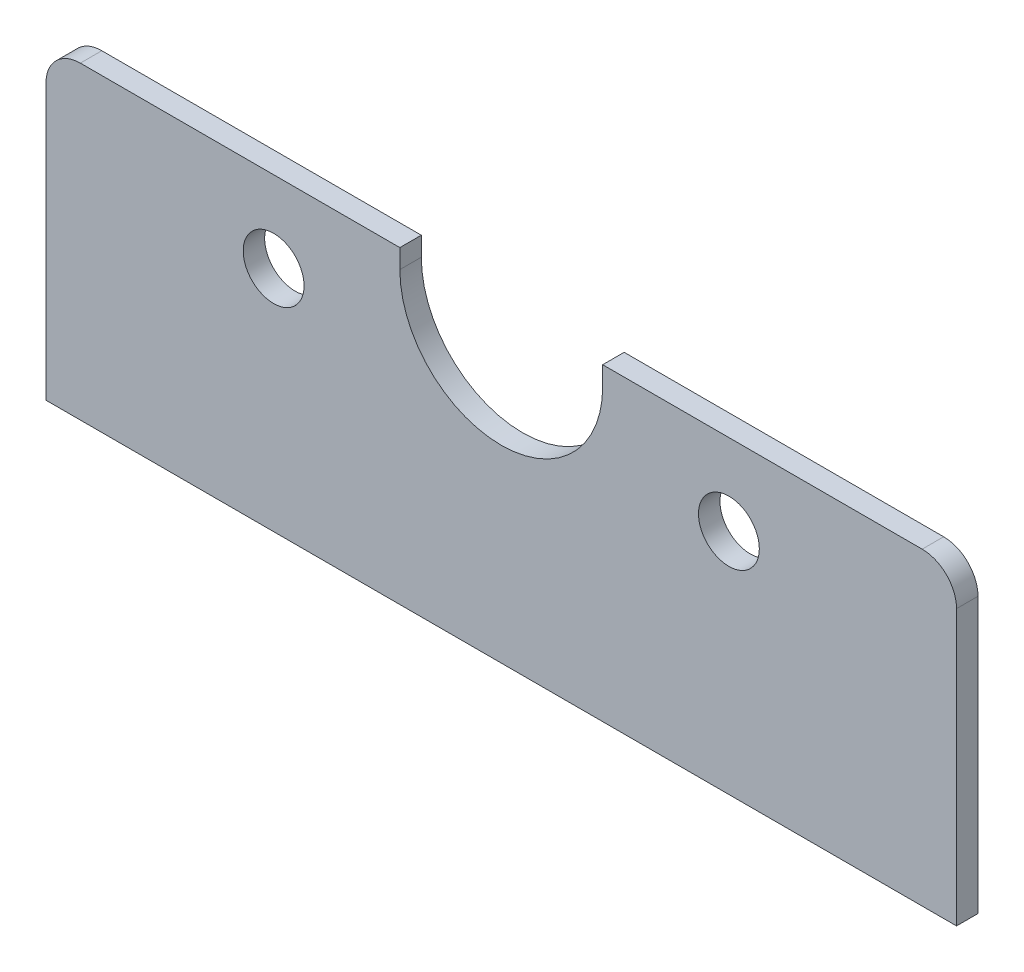
ISO-10303-21;
HEADER;
FILE_DESCRIPTION(('STEP AP214'),'2;1');
FILE_NAME('part.step','',(''),(''),'','','');
FILE_SCHEMA(('AUTOMOTIVE_DESIGN { 1 0 10303 214 1 1 1 1 }'));
ENDSEC;
DATA;
#1=APPLICATION_CONTEXT('core data for automotive mechanical design processes');
#2=APPLICATION_PROTOCOL_DEFINITION('international standard','automotive_design',2000,#1);
#3=PRODUCT_CONTEXT('',#1,'mechanical');
#4=PRODUCT('Part','Part','',(#3));
#5=PRODUCT_RELATED_PRODUCT_CATEGORY('part','',(#4));
#6=PRODUCT_DEFINITION_FORMATION('','',#4);
#7=PRODUCT_DEFINITION_CONTEXT('part definition',#1,'design');
#8=PRODUCT_DEFINITION('design','',#6,#7);
#9=PRODUCT_DEFINITION_SHAPE('','',#8);
#10=(LENGTH_UNIT() NAMED_UNIT(*) SI_UNIT(.MILLI.,.METRE.));
#11=(NAMED_UNIT(*) PLANE_ANGLE_UNIT() SI_UNIT($,.RADIAN.));
#12=(NAMED_UNIT(*) SI_UNIT($,.STERADIAN.) SOLID_ANGLE_UNIT());
#13=UNCERTAINTY_MEASURE_WITH_UNIT(LENGTH_MEASURE(1.E-05),#10,'distance_accuracy_value','');
#14=(GEOMETRIC_REPRESENTATION_CONTEXT(3) GLOBAL_UNCERTAINTY_ASSIGNED_CONTEXT((#13)) GLOBAL_UNIT_ASSIGNED_CONTEXT((#10,
#11,#12)) REPRESENTATION_CONTEXT('',''));
#15=CARTESIAN_POINT('',(0.,0.,0.));
#16=DIRECTION('',(0.,0.,1.));
#17=DIRECTION('',(1.,0.,0.));
#18=AXIS2_PLACEMENT_3D('',#15,#16,#17);
#19=CARTESIAN_POINT('',(12.4971848999787,30.603076560912,1.5875));
#20=DIRECTION('',(0.,0.,-1.));
#21=DIRECTION('',(-1.,0.,0.));
#22=AXIS2_PLACEMENT_3D('',#19,#20,#21);
#23=CYLINDRICAL_SURFACE('',#22,7.50000000000001);
#24=CARTESIAN_POINT('',(12.4971848999787,30.603076560912,0.));
#25=DIRECTION('',(0.,0.,1.));
#26=DIRECTION('',(1.,0.,0.));
#27=AXIS2_PLACEMENT_3D('',#24,#25,#26);
#28=CIRCLE('',#27,7.50000000000001);
#29=CARTESIAN_POINT('',(4.99718489997868,30.603076560912,0.));
#30=VERTEX_POINT('',#29);
#31=CARTESIAN_POINT('',(19.9971848999787,30.603076560912,0.));
#32=VERTEX_POINT('',#31);
#33=EDGE_CURVE('E116',#30,#32,#28,.T.);
#34=ORIENTED_EDGE('',*,*,#33,.F.);
#35=DIRECTION('',(0.,0.,-1.));
#36=VECTOR('',#35,1.);
#37=CARTESIAN_POINT('',(4.99718489997868,30.603076560912,1.5875));
#38=LINE('',#37,#36);
#39=CARTESIAN_POINT('',(4.99718489997868,30.603076560912,1.5875));
#40=VERTEX_POINT('',#39);
#41=EDGE_CURVE('E111',#40,#30,#38,.T.);
#42=ORIENTED_EDGE('',*,*,#41,.F.);
#43=CARTESIAN_POINT('',(12.4971848999787,30.603076560912,1.5875));
#44=DIRECTION('',(0.,0.,1.));
#45=DIRECTION('',(1.,0.,0.));
#46=AXIS2_PLACEMENT_3D('',#43,#44,#45);
#47=CIRCLE('',#46,7.50000000000001);
#48=CARTESIAN_POINT('',(19.9971848999787,30.603076560912,1.5875));
#49=VERTEX_POINT('',#48);
#50=EDGE_CURVE('E113',#40,#49,#47,.T.);
#51=ORIENTED_EDGE('',*,*,#50,.T.);
#52=DIRECTION('',(0.,0.,-1.));
#53=VECTOR('',#52,1.);
#54=CARTESIAN_POINT('',(19.9971848999787,30.603076560912,1.5875));
#55=LINE('',#54,#53);
#56=EDGE_CURVE('E152',#49,#32,#55,.T.);
#57=ORIENTED_EDGE('',*,*,#56,.T.);
#58=EDGE_LOOP('',(#34,#42,#51,#57));
#59=FACE_BOUND('',#58,.T.);
#60=ADVANCED_FACE('F35',(#59),#23,.F.);
#61=CARTESIAN_POINT('',(4.99718489997868,0.,1.5875));
#62=DIRECTION('',(1.,0.,0.));
#63=DIRECTION('',(0.,0.,-1.));
#64=AXIS2_PLACEMENT_3D('',#61,#62,#63);
#65=PLANE('',#64);
#66=DIRECTION('',(0.,-1.,0.));
#67=VECTOR('',#66,1.);
#68=CARTESIAN_POINT('',(4.99718489997868,0.,0.));
#69=LINE('',#68,#67);
#70=CARTESIAN_POINT('',(4.99718489997868,32.0127765609119,0.));
#71=VERTEX_POINT('',#70);
#72=EDGE_CURVE('E154',#71,#30,#69,.T.);
#73=ORIENTED_EDGE('',*,*,#72,.F.);
#74=DIRECTION('',(0.,0.,-1.));
#75=VECTOR('',#74,1.);
#76=CARTESIAN_POINT('',(4.99718489997868,32.0127765609119,1.5875));
#77=LINE('',#76,#75);
#78=CARTESIAN_POINT('',(4.99718489997868,32.0127765609119,1.5875));
#79=VERTEX_POINT('',#78);
#80=EDGE_CURVE('E122',#79,#71,#77,.T.);
#81=ORIENTED_EDGE('',*,*,#80,.F.);
#82=DIRECTION('',(0.,-1.,0.));
#83=VECTOR('',#82,1.);
#84=CARTESIAN_POINT('',(4.99718489997868,0.,1.5875));
#85=LINE('',#84,#83);
#86=EDGE_CURVE('E127',#79,#40,#85,.T.);
#87=ORIENTED_EDGE('',*,*,#86,.T.);
#88=ORIENTED_EDGE('',*,*,#41,.T.);
#89=EDGE_LOOP('',(#73,#81,#87,#88));
#90=FACE_BOUND('',#89,.T.);
#91=ADVANCED_FACE('F134',(#90),#65,.T.);
#92=CARTESIAN_POINT('',(0.,32.0127765609119,1.5875));
#93=DIRECTION('',(0.,1.,0.));
#94=DIRECTION('',(0.,0.,1.));
#95=AXIS2_PLACEMENT_3D('',#92,#93,#94);
#96=PLANE('',#95);
#97=DIRECTION('',(1.,0.,0.));
#98=VECTOR('',#97,1.);
#99=CARTESIAN_POINT('',(0.,32.0127765609119,0.));
#100=LINE('',#99,#98);
#101=CARTESIAN_POINT('',(-18.6288151000213,32.0127765609119,0.));
#102=VERTEX_POINT('',#101);
#103=EDGE_CURVE('E157',#102,#71,#100,.T.);
#104=ORIENTED_EDGE('',*,*,#103,.F.);
#105=DIRECTION('',(0.,0.,-1.));
#106=VECTOR('',#105,1.);
#107=CARTESIAN_POINT('',(-18.6288151000213,32.0127765609119,1.5875));
#108=LINE('',#107,#106);
#109=CARTESIAN_POINT('',(-18.6288151000213,32.0127765609119,1.5875));
#110=VERTEX_POINT('',#109);
#111=EDGE_CURVE('E11',#102,#110,#108,.F.);
#112=ORIENTED_EDGE('',*,*,#111,.T.);
#113=DIRECTION('',(1.,0.,0.));
#114=VECTOR('',#113,1.);
#115=CARTESIAN_POINT('',(0.,32.0127765609119,1.5875));
#116=LINE('',#115,#114);
#117=EDGE_CURVE('E136',#110,#79,#116,.T.);
#118=ORIENTED_EDGE('',*,*,#117,.T.);
#119=ORIENTED_EDGE('',*,*,#80,.T.);
#120=EDGE_LOOP('',(#104,#112,#118,#119));
#121=FACE_BOUND('',#120,.T.);
#122=ADVANCED_FACE('F234',(#121),#96,.T.);
#123=CARTESIAN_POINT('',(-21.1688151000213,0.,1.5875));
#124=DIRECTION('',(1.,0.,0.));
#125=DIRECTION('',(0.,1.,0.));
#126=AXIS2_PLACEMENT_3D('',#123,#124,#125);
#127=PLANE('',#126);
#128=DIRECTION('',(0.,-1.,0.));
#129=VECTOR('',#128,1.);
#130=CARTESIAN_POINT('',(-21.1688151000213,0.,1.5875));
#131=LINE('',#130,#129);
#132=CARTESIAN_POINT('',(-21.1688151000213,29.4727765609119,1.5875));
#133=VERTEX_POINT('',#132);
#134=CARTESIAN_POINT('',(-21.1688151000213,9.15277656091195,1.5875));
#135=VERTEX_POINT('',#134);
#136=EDGE_CURVE('E138',#133,#135,#131,.T.);
#137=ORIENTED_EDGE('',*,*,#136,.F.);
#138=DIRECTION('',(0.,0.,-1.));
#139=VECTOR('',#138,1.);
#140=CARTESIAN_POINT('',(-21.1688151000213,29.4727765609119,0.));
#141=LINE('',#140,#139);
#142=CARTESIAN_POINT('',(-21.1688151000213,29.4727765609119,0.));
#143=VERTEX_POINT('',#142);
#144=EDGE_CURVE('E43',#133,#143,#141,.T.);
#145=ORIENTED_EDGE('',*,*,#144,.T.);
#146=DIRECTION('',(0.,-1.,0.));
#147=VECTOR('',#146,1.);
#148=CARTESIAN_POINT('',(-21.1688151000213,0.,0.));
#149=LINE('',#148,#147);
#150=CARTESIAN_POINT('',(-21.1688151000213,9.15277656091195,0.));
#151=VERTEX_POINT('',#150);
#152=EDGE_CURVE('E159',#143,#151,#149,.T.);
#153=ORIENTED_EDGE('',*,*,#152,.T.);
#154=DIRECTION('',(0.,0.,-1.));
#155=VECTOR('',#154,1.);
#156=CARTESIAN_POINT('',(-21.1688151000213,9.15277656091195,1.5875));
#157=LINE('',#156,#155);
#158=EDGE_CURVE('E177',#135,#151,#157,.T.);
#159=ORIENTED_EDGE('',*,*,#158,.F.);
#160=EDGE_LOOP('',(#137,#145,#153,#159));
#161=FACE_BOUND('',#160,.T.);
#162=ADVANCED_FACE('F195',(#161),#127,.F.);
#163=CARTESIAN_POINT('',(0.,9.15277656091195,1.5875));
#164=DIRECTION('',(0.,1.,0.));
#165=DIRECTION('',(0.,0.,1.));
#166=AXIS2_PLACEMENT_3D('',#163,#164,#165);
#167=PLANE('',#166);
#168=DIRECTION('',(1.,0.,0.));
#169=VECTOR('',#168,1.);
#170=CARTESIAN_POINT('',(0.,9.15277656091195,0.));
#171=LINE('',#170,#169);
#172=CARTESIAN_POINT('',(46.1631848999787,9.15277656091195,0.));
#173=VERTEX_POINT('',#172);
#174=EDGE_CURVE('E161',#151,#173,#171,.T.);
#175=ORIENTED_EDGE('',*,*,#174,.T.);
#176=DIRECTION('',(0.,0.,-1.));
#177=VECTOR('',#176,1.);
#178=CARTESIAN_POINT('',(46.1631848999787,9.15277656091195,1.5875));
#179=LINE('',#178,#177);
#180=CARTESIAN_POINT('',(46.1631848999787,9.15277656091195,1.5875));
#181=VERTEX_POINT('',#180);
#182=EDGE_CURVE('E174',#181,#173,#179,.T.);
#183=ORIENTED_EDGE('',*,*,#182,.F.);
#184=DIRECTION('',(1.,0.,0.));
#185=VECTOR('',#184,1.);
#186=CARTESIAN_POINT('',(0.,9.15277656091195,1.5875));
#187=LINE('',#186,#185);
#188=EDGE_CURVE('E143',#135,#181,#187,.T.);
#189=ORIENTED_EDGE('',*,*,#188,.F.);
#190=ORIENTED_EDGE('',*,*,#158,.T.);
#191=EDGE_LOOP('',(#175,#183,#189,#190));
#192=FACE_BOUND('',#191,.T.);
#193=ADVANCED_FACE('F204',(#192),#167,.F.);
#194=CARTESIAN_POINT('',(46.1631848999787,0.,1.5875));
#195=DIRECTION('',(1.,0.,0.));
#196=DIRECTION('',(0.,0.,-1.));
#197=AXIS2_PLACEMENT_3D('',#194,#195,#196);
#198=PLANE('',#197);
#199=DIRECTION('',(0.,-1.,0.));
#200=VECTOR('',#199,1.);
#201=CARTESIAN_POINT('',(46.1631848999787,0.,0.));
#202=LINE('',#201,#200);
#203=CARTESIAN_POINT('',(46.1631848999787,29.4727765609119,0.));
#204=VERTEX_POINT('',#203);
#205=EDGE_CURVE('E164',#204,#173,#202,.T.);
#206=ORIENTED_EDGE('',*,*,#205,.F.);
#207=DIRECTION('',(0.,0.,-1.));
#208=VECTOR('',#207,1.);
#209=CARTESIAN_POINT('',(46.1631848999787,29.4727765609119,1.5875));
#210=LINE('',#209,#208);
#211=CARTESIAN_POINT('',(46.1631848999787,29.4727765609119,1.5875));
#212=VERTEX_POINT('',#211);
#213=EDGE_CURVE('E187',#204,#212,#210,.F.);
#214=ORIENTED_EDGE('',*,*,#213,.T.);
#215=DIRECTION('',(0.,-1.,0.));
#216=VECTOR('',#215,1.);
#217=CARTESIAN_POINT('',(46.1631848999787,0.,1.5875));
#218=LINE('',#217,#216);
#219=EDGE_CURVE('E146',#212,#181,#218,.T.);
#220=ORIENTED_EDGE('',*,*,#219,.T.);
#221=ORIENTED_EDGE('',*,*,#182,.T.);
#222=EDGE_LOOP('',(#206,#214,#220,#221));
#223=FACE_BOUND('',#222,.T.);
#224=ADVANCED_FACE('F226',(#223),#198,.T.);
#225=CARTESIAN_POINT('',(0.,32.0127765609119,1.5875));
#226=DIRECTION('',(0.,1.,0.));
#227=DIRECTION('',(0.,0.,1.));
#228=AXIS2_PLACEMENT_3D('',#225,#226,#227);
#229=PLANE('',#228);
#230=DIRECTION('',(1.,0.,0.));
#231=VECTOR('',#230,1.);
#232=CARTESIAN_POINT('',(0.,32.0127765609119,1.5875));
#233=LINE('',#232,#231);
#234=CARTESIAN_POINT('',(19.9971848999787,32.0127765609119,1.5875));
#235=VERTEX_POINT('',#234);
#236=CARTESIAN_POINT('',(43.6231848999787,32.0127765609119,1.5875));
#237=VERTEX_POINT('',#236);
#238=EDGE_CURVE('E148',#235,#237,#233,.T.);
#239=ORIENTED_EDGE('',*,*,#238,.T.);
#240=DIRECTION('',(0.,0.,-1.));
#241=VECTOR('',#240,1.);
#242=CARTESIAN_POINT('',(43.6231848999787,32.0127765609119,1.5875));
#243=LINE('',#242,#241);
#244=CARTESIAN_POINT('',(43.6231848999787,32.0127765609119,0.));
#245=VERTEX_POINT('',#244);
#246=EDGE_CURVE('E121',#237,#245,#243,.T.);
#247=ORIENTED_EDGE('',*,*,#246,.T.);
#248=DIRECTION('',(1.,0.,0.));
#249=VECTOR('',#248,1.);
#250=CARTESIAN_POINT('',(0.,32.0127765609119,0.));
#251=LINE('',#250,#249);
#252=CARTESIAN_POINT('',(19.9971848999787,32.0127765609119,0.));
#253=VERTEX_POINT('',#252);
#254=EDGE_CURVE('E166',#253,#245,#251,.T.);
#255=ORIENTED_EDGE('',*,*,#254,.F.);
#256=DIRECTION('',(0.,0.,-1.));
#257=VECTOR('',#256,1.);
#258=CARTESIAN_POINT('',(19.9971848999787,32.0127765609119,1.5875));
#259=LINE('',#258,#257);
#260=EDGE_CURVE('E172',#235,#253,#259,.T.);
#261=ORIENTED_EDGE('',*,*,#260,.F.);
#262=EDGE_LOOP('',(#239,#247,#255,#261));
#263=FACE_BOUND('',#262,.T.);
#264=ADVANCED_FACE('F214',(#263),#229,.T.);
#265=CARTESIAN_POINT('',(19.9971848999787,0.,1.5875));
#266=DIRECTION('',(-1.,0.,0.));
#267=DIRECTION('',(0.,0.,1.));
#268=AXIS2_PLACEMENT_3D('',#265,#266,#267);
#269=PLANE('',#268);
#270=DIRECTION('',(0.,1.,0.));
#271=VECTOR('',#270,1.);
#272=CARTESIAN_POINT('',(19.9971848999787,0.,0.));
#273=LINE('',#272,#271);
#274=EDGE_CURVE('E131',#32,#253,#273,.T.);
#275=ORIENTED_EDGE('',*,*,#274,.F.);
#276=ORIENTED_EDGE('',*,*,#56,.F.);
#277=DIRECTION('',(0.,1.,0.));
#278=VECTOR('',#277,1.);
#279=CARTESIAN_POINT('',(19.9971848999787,0.,1.5875));
#280=LINE('',#279,#278);
#281=EDGE_CURVE('E130',#49,#235,#280,.T.);
#282=ORIENTED_EDGE('',*,*,#281,.T.);
#283=ORIENTED_EDGE('',*,*,#260,.T.);
#284=EDGE_LOOP('',(#275,#276,#282,#283));
#285=FACE_BOUND('',#284,.T.);
#286=ADVANCED_FACE('F217',(#285),#269,.T.);
#287=CARTESIAN_POINT('',(0.,0.,1.5875));
#288=DIRECTION('',(0.,0.,1.));
#289=DIRECTION('',(1.,0.,0.));
#290=AXIS2_PLACEMENT_3D('',#287,#288,#289);
#291=PLANE('',#290);
#292=CARTESIAN_POINT('',(-4.33581510002132,26.012776560912,1.5875));
#293=DIRECTION('',(0.,0.,1.));
#294=DIRECTION('',(1.,0.,0.));
#295=AXIS2_PLACEMENT_3D('',#292,#293,#294);
#296=CIRCLE('',#295,2.24999999999999);
#297=CARTESIAN_POINT('',(-2.08581510002133,26.012776560912,1.5875));
#298=VERTEX_POINT('',#297);
#299=EDGE_CURVE('E267',#298,#298,#296,.T.);
#300=ORIENTED_EDGE('',*,*,#299,.F.);
#301=EDGE_LOOP('',(#300));
#302=FACE_BOUND('',#301,.T.);
#303=CARTESIAN_POINT('',(29.3301848999787,26.012776560912,1.5875));
#304=DIRECTION('',(0.,0.,1.));
#305=DIRECTION('',(1.,0.,0.));
#306=AXIS2_PLACEMENT_3D('',#303,#304,#305);
#307=CIRCLE('',#306,2.24999999999999);
#308=CARTESIAN_POINT('',(31.5801848999787,26.012776560912,1.5875));
#309=VERTEX_POINT('',#308);
#310=EDGE_CURVE('E262',#309,#309,#307,.T.);
#311=ORIENTED_EDGE('',*,*,#310,.F.);
#312=EDGE_LOOP('',(#311));
#313=FACE_BOUND('',#312,.T.);
#314=ORIENTED_EDGE('',*,*,#219,.F.);
#315=CARTESIAN_POINT('',(43.6231848999787,29.4727765609119,1.5875));
#316=DIRECTION('',(0.,0.,1.));
#317=DIRECTION('',(1.,0.,0.));
#318=AXIS2_PLACEMENT_3D('',#315,#316,#317);
#319=CIRCLE('',#318,2.54);
#320=EDGE_CURVE('E190',#212,#237,#319,.T.);
#321=ORIENTED_EDGE('',*,*,#320,.T.);
#322=ORIENTED_EDGE('',*,*,#238,.F.);
#323=ORIENTED_EDGE('',*,*,#281,.F.);
#324=ORIENTED_EDGE('',*,*,#50,.F.);
#325=ORIENTED_EDGE('',*,*,#86,.F.);
#326=ORIENTED_EDGE('',*,*,#117,.F.);
#327=CARTESIAN_POINT('',(-18.6288151000213,29.4727765609119,1.5875));
#328=DIRECTION('',(0.,0.,1.));
#329=DIRECTION('',(1.,0.,0.));
#330=AXIS2_PLACEMENT_3D('',#327,#328,#329);
#331=CIRCLE('',#330,2.54);
#332=EDGE_CURVE('E50',#110,#133,#331,.T.);
#333=ORIENTED_EDGE('',*,*,#332,.T.);
#334=ORIENTED_EDGE('',*,*,#136,.T.);
#335=ORIENTED_EDGE('',*,*,#188,.T.);
#336=EDGE_LOOP('',(#314,#321,#322,#323,#324,#325,#326,#333,#334,#335));
#337=FACE_BOUND('',#336,.T.);
#338=ADVANCED_FACE('F126',(#302,#313,#337),#291,.T.);
#339=CARTESIAN_POINT('',(0.,0.,0.));
#340=DIRECTION('',(0.,0.,1.));
#341=DIRECTION('',(1.,0.,0.));
#342=AXIS2_PLACEMENT_3D('',#339,#340,#341);
#343=PLANE('',#342);
#344=CARTESIAN_POINT('',(-4.33581510002132,26.012776560912,0.));
#345=DIRECTION('',(0.,0.,1.));
#346=DIRECTION('',(1.,0.,0.));
#347=AXIS2_PLACEMENT_3D('',#344,#345,#346);
#348=CIRCLE('',#347,2.25);
#349=CARTESIAN_POINT('',(-2.08581510002132,26.012776560912,0.));
#350=VERTEX_POINT('',#349);
#351=EDGE_CURVE('E259',#350,#350,#348,.T.);
#352=ORIENTED_EDGE('',*,*,#351,.T.);
#353=EDGE_LOOP('',(#352));
#354=FACE_BOUND('',#353,.T.);
#355=CARTESIAN_POINT('',(29.3301848999787,26.012776560912,0.));
#356=DIRECTION('',(0.,0.,1.));
#357=DIRECTION('',(1.,0.,0.));
#358=AXIS2_PLACEMENT_3D('',#355,#356,#357);
#359=CIRCLE('',#358,2.25);
#360=CARTESIAN_POINT('',(31.5801848999787,26.012776560912,0.));
#361=VERTEX_POINT('',#360);
#362=EDGE_CURVE('E155',#361,#361,#359,.T.);
#363=ORIENTED_EDGE('',*,*,#362,.T.);
#364=EDGE_LOOP('',(#363));
#365=FACE_BOUND('',#364,.T.);
#366=ORIENTED_EDGE('',*,*,#254,.T.);
#367=CARTESIAN_POINT('',(43.6231848999787,29.4727765609119,0.));
#368=DIRECTION('',(0.,0.,1.));
#369=DIRECTION('',(1.,0.,0.));
#370=AXIS2_PLACEMENT_3D('',#367,#368,#369);
#371=CIRCLE('',#370,2.54);
#372=EDGE_CURVE('E185',#245,#204,#371,.F.);
#373=ORIENTED_EDGE('',*,*,#372,.T.);
#374=ORIENTED_EDGE('',*,*,#205,.T.);
#375=ORIENTED_EDGE('',*,*,#174,.F.);
#376=ORIENTED_EDGE('',*,*,#152,.F.);
#377=CARTESIAN_POINT('',(-18.6288151000213,29.4727765609119,0.));
#378=DIRECTION('',(0.,0.,1.));
#379=DIRECTION('',(1.,0.,0.));
#380=AXIS2_PLACEMENT_3D('',#377,#378,#379);
#381=CIRCLE('',#380,2.54);
#382=EDGE_CURVE('E183',#143,#102,#381,.F.);
#383=ORIENTED_EDGE('',*,*,#382,.T.);
#384=ORIENTED_EDGE('',*,*,#103,.T.);
#385=ORIENTED_EDGE('',*,*,#72,.T.);
#386=ORIENTED_EDGE('',*,*,#33,.T.);
#387=ORIENTED_EDGE('',*,*,#274,.T.);
#388=EDGE_LOOP('',(#366,#373,#374,#375,#376,#383,#384,#385,#386,#387));
#389=FACE_BOUND('',#388,.T.);
#390=ADVANCED_FACE('F200',(#354,#365,#389),#343,.F.);
#391=CARTESIAN_POINT('',(29.3301848999787,26.012776560912,1.5875));
#392=DIRECTION('',(0.,0.,1.));
#393=DIRECTION('',(1.,0.,0.));
#394=AXIS2_PLACEMENT_3D('',#391,#392,#393);
#395=CYLINDRICAL_SURFACE('',#394,2.25);
#396=ORIENTED_EDGE('',*,*,#362,.F.);
#397=EDGE_LOOP('',(#396));
#398=FACE_BOUND('',#397,.T.);
#399=ORIENTED_EDGE('',*,*,#310,.T.);
#400=EDGE_LOOP('',(#399));
#401=FACE_BOUND('',#400,.T.);
#402=ADVANCED_FACE('F243',(#398,#401),#395,.F.);
#403=CARTESIAN_POINT('',(-4.33581510002132,26.012776560912,1.5875));
#404=DIRECTION('',(0.,0.,1.));
#405=DIRECTION('',(1.,0.,0.));
#406=AXIS2_PLACEMENT_3D('',#403,#404,#405);
#407=CYLINDRICAL_SURFACE('',#406,2.24999999999999);
#408=ORIENTED_EDGE('',*,*,#351,.F.);
#409=EDGE_LOOP('',(#408));
#410=FACE_BOUND('',#409,.T.);
#411=ORIENTED_EDGE('',*,*,#299,.T.);
#412=EDGE_LOOP('',(#411));
#413=FACE_BOUND('',#412,.T.);
#414=ADVANCED_FACE('F238',(#410,#413),#407,.F.);
#415=CARTESIAN_POINT('',(43.6231848999787,29.4727765609119,1.5875));
#416=DIRECTION('',(0.,0.,-1.));
#417=DIRECTION('',(-1.,0.,0.));
#418=AXIS2_PLACEMENT_3D('',#415,#416,#417);
#419=CYLINDRICAL_SURFACE('',#418,2.54);
#420=ORIENTED_EDGE('',*,*,#320,.F.);
#421=ORIENTED_EDGE('',*,*,#213,.F.);
#422=ORIENTED_EDGE('',*,*,#372,.F.);
#423=ORIENTED_EDGE('',*,*,#246,.F.);
#424=EDGE_LOOP('',(#420,#421,#422,#423));
#425=FACE_BOUND('',#424,.T.);
#426=ADVANCED_FACE('F211',(#425),#419,.T.);
#427=CARTESIAN_POINT('',(-18.6288151000213,29.4727765609119,1.5875));
#428=DIRECTION('',(0.,0.,1.));
#429=DIRECTION('',(1.,0.,0.));
#430=AXIS2_PLACEMENT_3D('',#427,#428,#429);
#431=CYLINDRICAL_SURFACE('',#430,2.54);
#432=ORIENTED_EDGE('',*,*,#332,.F.);
#433=ORIENTED_EDGE('',*,*,#111,.F.);
#434=ORIENTED_EDGE('',*,*,#382,.F.);
#435=ORIENTED_EDGE('',*,*,#144,.F.);
#436=EDGE_LOOP('',(#432,#433,#434,#435));
#437=FACE_BOUND('',#436,.T.);
#438=ADVANCED_FACE('F37',(#437),#431,.T.);
#439=CLOSED_SHELL('',(#60,#91,#122,#162,#193,#224,#264,#286,#338,#390,#402,#414,#426,#438));
#440=MANIFOLD_SOLID_BREP('B2',#439);
#441=ADVANCED_BREP_SHAPE_REPRESENTATION('',(#18,#440),#14);
#442=SHAPE_DEFINITION_REPRESENTATION(#9,#441);
ENDSEC;
END-ISO-10303-21;
